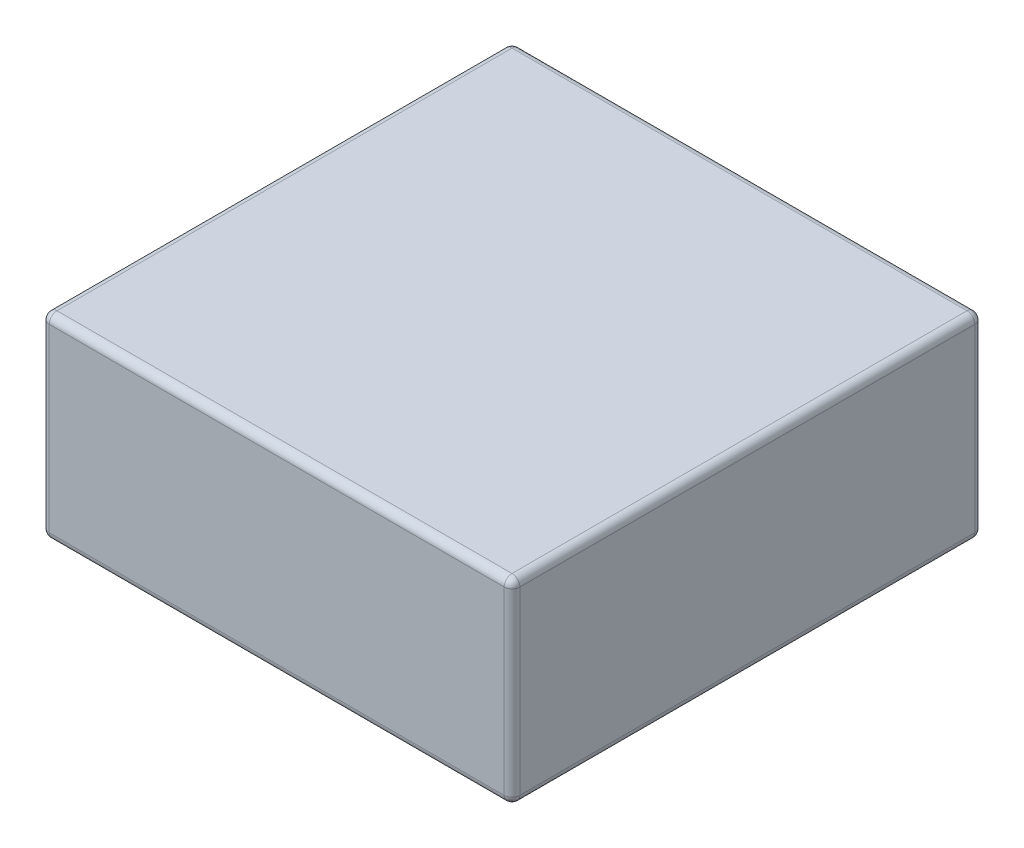
ISO-10303-21;
HEADER;
FILE_DESCRIPTION(('STEP AP214'),'2;1');
FILE_NAME('part.step','',(''),(''),'','','');
FILE_SCHEMA(('AUTOMOTIVE_DESIGN { 1 0 10303 214 1 1 1 1 }'));
ENDSEC;
DATA;
#1=APPLICATION_CONTEXT('core data for automotive mechanical design processes');
#2=APPLICATION_PROTOCOL_DEFINITION('international standard','automotive_design',2000,#1);
#3=PRODUCT_CONTEXT('',#1,'mechanical');
#4=PRODUCT('Part','Part','',(#3));
#5=PRODUCT_RELATED_PRODUCT_CATEGORY('part','',(#4));
#6=PRODUCT_DEFINITION_FORMATION('','',#4);
#7=PRODUCT_DEFINITION_CONTEXT('part definition',#1,'design');
#8=PRODUCT_DEFINITION('design','',#6,#7);
#9=PRODUCT_DEFINITION_SHAPE('','',#8);
#10=(LENGTH_UNIT() NAMED_UNIT(*) SI_UNIT(.MILLI.,.METRE.));
#11=(NAMED_UNIT(*) PLANE_ANGLE_UNIT() SI_UNIT($,.RADIAN.));
#12=(NAMED_UNIT(*) SI_UNIT($,.STERADIAN.) SOLID_ANGLE_UNIT());
#13=UNCERTAINTY_MEASURE_WITH_UNIT(LENGTH_MEASURE(1.E-05),#10,'distance_accuracy_value','');
#14=(GEOMETRIC_REPRESENTATION_CONTEXT(3) GLOBAL_UNCERTAINTY_ASSIGNED_CONTEXT((#13)) GLOBAL_UNIT_ASSIGNED_CONTEXT((#10,
#11,#12)) REPRESENTATION_CONTEXT('',''));
#15=CARTESIAN_POINT('',(0.,0.,0.));
#16=DIRECTION('',(0.,0.,1.));
#17=DIRECTION('',(1.,0.,0.));
#18=AXIS2_PLACEMENT_3D('',#15,#16,#17);
#19=CARTESIAN_POINT('',(-60.,12.5,-30.));
#20=DIRECTION('',(0.,0.,-1.));
#21=DIRECTION('',(-1.,0.,0.));
#22=AXIS2_PLACEMENT_3D('',#19,#20,#21);
#23=PLANE('',#22);
#24=DIRECTION('',(1.,0.,0.));
#25=VECTOR('',#24,1.);
#26=CARTESIAN_POINT('',(-60.,-11.5,-30.));
#27=LINE('',#26,#25);
#28=CARTESIAN_POINT('',(-1.,-11.5,-30.));
#29=VERTEX_POINT('',#28);
#30=CARTESIAN_POINT('',(-59.,-11.5,-30.));
#31=VERTEX_POINT('',#30);
#32=EDGE_CURVE('E240',#29,#31,#27,.F.);
#33=ORIENTED_EDGE('',*,*,#32,.T.);
#34=DIRECTION('',(0.,1.,0.));
#35=VECTOR('',#34,1.);
#36=CARTESIAN_POINT('',(-59.,11.5,-30.));
#37=LINE('',#36,#35);
#38=CARTESIAN_POINT('',(-59.,11.5,-30.));
#39=VERTEX_POINT('',#38);
#40=EDGE_CURVE('E136',#31,#39,#37,.T.);
#41=ORIENTED_EDGE('',*,*,#40,.T.);
#42=DIRECTION('',(1.,0.,0.));
#43=VECTOR('',#42,1.);
#44=CARTESIAN_POINT('',(-60.,11.5,-30.));
#45=LINE('',#44,#43);
#46=CARTESIAN_POINT('',(-1.,11.5,-30.));
#47=VERTEX_POINT('',#46);
#48=EDGE_CURVE('E236',#39,#47,#45,.T.);
#49=ORIENTED_EDGE('',*,*,#48,.T.);
#50=DIRECTION('',(0.,1.,0.));
#51=VECTOR('',#50,1.);
#52=CARTESIAN_POINT('',(-1.,12.5,-30.));
#53=LINE('',#52,#51);
#54=EDGE_CURVE('E238',#47,#29,#53,.F.);
#55=ORIENTED_EDGE('',*,*,#54,.T.);
#56=EDGE_LOOP('',(#33,#41,#49,#55));
#57=FACE_BOUND('',#56,.T.);
#58=ADVANCED_FACE('F35',(#57),#23,.T.);
#59=CARTESIAN_POINT('',(-60.,-12.5,30.));
#60=DIRECTION('',(0.,-1.,0.));
#61=DIRECTION('',(0.,0.,-1.));
#62=AXIS2_PLACEMENT_3D('',#59,#60,#61);
#63=PLANE('',#62);
#64=DIRECTION('',(0.,0.,-1.));
#65=VECTOR('',#64,1.);
#66=CARTESIAN_POINT('',(-59.,-12.5,-30.));
#67=LINE('',#66,#65);
#68=CARTESIAN_POINT('',(-59.,-12.5,29.));
#69=VERTEX_POINT('',#68);
#70=CARTESIAN_POINT('',(-59.,-12.5,-29.));
#71=VERTEX_POINT('',#70);
#72=EDGE_CURVE('E227',#69,#71,#67,.T.);
#73=ORIENTED_EDGE('',*,*,#72,.T.);
#74=DIRECTION('',(1.,0.,0.));
#75=VECTOR('',#74,1.);
#76=CARTESIAN_POINT('',(-60.,-12.5,-29.));
#77=LINE('',#76,#75);
#78=CARTESIAN_POINT('',(-1.,-12.5,-29.));
#79=VERTEX_POINT('',#78);
#80=EDGE_CURVE('E251',#71,#79,#77,.T.);
#81=ORIENTED_EDGE('',*,*,#80,.T.);
#82=DIRECTION('',(0.,0.,-1.));
#83=VECTOR('',#82,1.);
#84=CARTESIAN_POINT('',(-1.,-12.5,30.));
#85=LINE('',#84,#83);
#86=CARTESIAN_POINT('',(-1.,-12.5,29.));
#87=VERTEX_POINT('',#86);
#88=EDGE_CURVE('E148',#79,#87,#85,.F.);
#89=ORIENTED_EDGE('',*,*,#88,.T.);
#90=DIRECTION('',(1.,0.,0.));
#91=VECTOR('',#90,1.);
#92=CARTESIAN_POINT('',(-60.,-12.5,29.));
#93=LINE('',#92,#91);
#94=EDGE_CURVE('E249',#87,#69,#93,.F.);
#95=ORIENTED_EDGE('',*,*,#94,.T.);
#96=EDGE_LOOP('',(#73,#81,#89,#95));
#97=FACE_BOUND('',#96,.T.);
#98=ADVANCED_FACE('F299',(#97),#63,.T.);
#99=CARTESIAN_POINT('',(-60.,12.5,30.));
#100=DIRECTION('',(0.,0.,1.));
#101=DIRECTION('',(0.,-1.,0.));
#102=AXIS2_PLACEMENT_3D('',#99,#100,#101);
#103=PLANE('',#102);
#104=DIRECTION('',(1.,0.,0.));
#105=VECTOR('',#104,1.);
#106=CARTESIAN_POINT('',(-60.,11.5,30.));
#107=LINE('',#106,#105);
#108=CARTESIAN_POINT('',(-1.,11.5,30.));
#109=VERTEX_POINT('',#108);
#110=CARTESIAN_POINT('',(-59.,11.5,30.));
#111=VERTEX_POINT('',#110);
#112=EDGE_CURVE('E265',#109,#111,#107,.F.);
#113=ORIENTED_EDGE('',*,*,#112,.T.);
#114=DIRECTION('',(0.,-1.,0.));
#115=VECTOR('',#114,1.);
#116=CARTESIAN_POINT('',(-59.,-11.5,30.));
#117=LINE('',#116,#115);
#118=CARTESIAN_POINT('',(-59.,-11.5,30.));
#119=VERTEX_POINT('',#118);
#120=EDGE_CURVE('E160',#111,#119,#117,.T.);
#121=ORIENTED_EDGE('',*,*,#120,.T.);
#122=DIRECTION('',(1.,0.,0.));
#123=VECTOR('',#122,1.);
#124=CARTESIAN_POINT('',(-60.,-11.5,30.));
#125=LINE('',#124,#123);
#126=CARTESIAN_POINT('',(-1.,-11.5,30.));
#127=VERTEX_POINT('',#126);
#128=EDGE_CURVE('E60',#119,#127,#125,.T.);
#129=ORIENTED_EDGE('',*,*,#128,.T.);
#130=DIRECTION('',(0.,-1.,0.));
#131=VECTOR('',#130,1.);
#132=CARTESIAN_POINT('',(-1.,12.5,30.));
#133=LINE('',#132,#131);
#134=EDGE_CURVE('E267',#127,#109,#133,.F.);
#135=ORIENTED_EDGE('',*,*,#134,.T.);
#136=EDGE_LOOP('',(#113,#121,#129,#135));
#137=FACE_BOUND('',#136,.T.);
#138=ADVANCED_FACE('F283',(#137),#103,.T.);
#139=CARTESIAN_POINT('',(-60.,12.5,30.));
#140=DIRECTION('',(0.,1.,0.));
#141=DIRECTION('',(0.,0.,1.));
#142=AXIS2_PLACEMENT_3D('',#139,#140,#141);
#143=PLANE('',#142);
#144=DIRECTION('',(0.,0.,1.));
#145=VECTOR('',#144,1.);
#146=CARTESIAN_POINT('',(-1.,12.5,30.));
#147=LINE('',#146,#145);
#148=CARTESIAN_POINT('',(-1.,12.5,29.));
#149=VERTEX_POINT('',#148);
#150=CARTESIAN_POINT('',(-1.,12.5,-29.));
#151=VERTEX_POINT('',#150);
#152=EDGE_CURVE('E212',#149,#151,#147,.F.);
#153=ORIENTED_EDGE('',*,*,#152,.T.);
#154=DIRECTION('',(1.,0.,0.));
#155=VECTOR('',#154,1.);
#156=CARTESIAN_POINT('',(-60.,12.5,-29.));
#157=LINE('',#156,#155);
#158=CARTESIAN_POINT('',(-59.,12.5,-29.));
#159=VERTEX_POINT('',#158);
#160=EDGE_CURVE('E11',#151,#159,#157,.F.);
#161=ORIENTED_EDGE('',*,*,#160,.T.);
#162=DIRECTION('',(0.,0.,1.));
#163=VECTOR('',#162,1.);
#164=CARTESIAN_POINT('',(-59.,12.5,30.));
#165=LINE('',#164,#163);
#166=CARTESIAN_POINT('',(-59.,12.5,29.));
#167=VERTEX_POINT('',#166);
#168=EDGE_CURVE('E217',#159,#167,#165,.T.);
#169=ORIENTED_EDGE('',*,*,#168,.T.);
#170=DIRECTION('',(1.,0.,0.));
#171=VECTOR('',#170,1.);
#172=CARTESIAN_POINT('',(-60.,12.5,29.));
#173=LINE('',#172,#171);
#174=EDGE_CURVE('E44',#167,#149,#173,.T.);
#175=ORIENTED_EDGE('',*,*,#174,.T.);
#176=EDGE_LOOP('',(#153,#161,#169,#175));
#177=FACE_BOUND('',#176,.T.);
#178=ADVANCED_FACE('F270',(#177),#143,.T.);
#179=CARTESIAN_POINT('',(-60.,0.,0.));
#180=DIRECTION('',(1.,0.,0.));
#181=DIRECTION('',(0.,0.,-1.));
#182=AXIS2_PLACEMENT_3D('',#179,#180,#181);
#183=PLANE('',#182);
#184=DIRECTION('',(0.,0.,1.));
#185=VECTOR('',#184,1.);
#186=CARTESIAN_POINT('',(-60.,11.5,-30.));
#187=LINE('',#186,#185);
#188=CARTESIAN_POINT('',(-60.,11.5,29.));
#189=VERTEX_POINT('',#188);
#190=CARTESIAN_POINT('',(-60.,11.5,-29.));
#191=VERTEX_POINT('',#190);
#192=EDGE_CURVE('E131',#189,#191,#187,.F.);
#193=ORIENTED_EDGE('',*,*,#192,.T.);
#194=DIRECTION('',(0.,1.,0.));
#195=VECTOR('',#194,1.);
#196=CARTESIAN_POINT('',(-60.,-11.5,-29.));
#197=LINE('',#196,#195);
#198=CARTESIAN_POINT('',(-60.,-11.5,-29.));
#199=VERTEX_POINT('',#198);
#200=EDGE_CURVE('E135',#191,#199,#197,.F.);
#201=ORIENTED_EDGE('',*,*,#200,.T.);
#202=DIRECTION('',(0.,0.,-1.));
#203=VECTOR('',#202,1.);
#204=CARTESIAN_POINT('',(-60.,-11.5,30.));
#205=LINE('',#204,#203);
#206=CARTESIAN_POINT('',(-60.,-11.5,29.));
#207=VERTEX_POINT('',#206);
#208=EDGE_CURVE('E133',#199,#207,#205,.F.);
#209=ORIENTED_EDGE('',*,*,#208,.T.);
#210=DIRECTION('',(0.,-1.,0.));
#211=VECTOR('',#210,1.);
#212=CARTESIAN_POINT('',(-60.,11.5,29.));
#213=LINE('',#212,#211);
#214=EDGE_CURVE('E128',#207,#189,#213,.F.);
#215=ORIENTED_EDGE('',*,*,#214,.T.);
#216=EDGE_LOOP('',(#193,#201,#209,#215));
#217=FACE_BOUND('',#216,.T.);
#218=ADVANCED_FACE('F130',(#217),#183,.F.);
#219=CARTESIAN_POINT('',(0.,0.,0.));
#220=DIRECTION('',(1.,0.,0.));
#221=DIRECTION('',(0.,0.,-1.));
#222=AXIS2_PLACEMENT_3D('',#219,#220,#221);
#223=PLANE('',#222);
#224=DIRECTION('',(0.,0.,-1.));
#225=VECTOR('',#224,1.);
#226=CARTESIAN_POINT('',(0.,-11.5,0.));
#227=LINE('',#226,#225);
#228=CARTESIAN_POINT('',(0.,-11.5,29.));
#229=VERTEX_POINT('',#228);
#230=CARTESIAN_POINT('',(0.,-11.5,-29.));
#231=VERTEX_POINT('',#230);
#232=EDGE_CURVE('E157',#229,#231,#227,.T.);
#233=ORIENTED_EDGE('',*,*,#232,.T.);
#234=DIRECTION('',(0.,1.,0.));
#235=VECTOR('',#234,1.);
#236=CARTESIAN_POINT('',(0.,0.,-29.));
#237=LINE('',#236,#235);
#238=CARTESIAN_POINT('',(0.,11.5,-29.));
#239=VERTEX_POINT('',#238);
#240=EDGE_CURVE('E259',#231,#239,#237,.T.);
#241=ORIENTED_EDGE('',*,*,#240,.T.);
#242=DIRECTION('',(0.,0.,1.));
#243=VECTOR('',#242,1.);
#244=CARTESIAN_POINT('',(0.,11.5,0.));
#245=LINE('',#244,#243);
#246=CARTESIAN_POINT('',(0.,11.5,29.));
#247=VERTEX_POINT('',#246);
#248=EDGE_CURVE('E230',#239,#247,#245,.T.);
#249=ORIENTED_EDGE('',*,*,#248,.T.);
#250=DIRECTION('',(0.,-1.,0.));
#251=VECTOR('',#250,1.);
#252=CARTESIAN_POINT('',(0.,0.,29.));
#253=LINE('',#252,#251);
#254=EDGE_CURVE('E257',#247,#229,#253,.T.);
#255=ORIENTED_EDGE('',*,*,#254,.T.);
#256=EDGE_LOOP('',(#233,#241,#249,#255));
#257=FACE_BOUND('',#256,.T.);
#258=ADVANCED_FACE('F287',(#257),#223,.T.);
#259=CARTESIAN_POINT('',(-59.,11.5,30.));
#260=DIRECTION('',(0.,0.,-1.));
#261=DIRECTION('',(-1.,0.,0.));
#262=AXIS2_PLACEMENT_3D('',#259,#260,#261);
#263=CYLINDRICAL_SURFACE('',#262,1.);
#264=ORIENTED_EDGE('',*,*,#168,.F.);
#265=CARTESIAN_POINT('',(-59.,11.5,-29.));
#266=DIRECTION('',(0.,0.,-1.));
#267=DIRECTION('',(-1.,0.,0.));
#268=AXIS2_PLACEMENT_3D('',#265,#266,#267);
#269=CIRCLE('',#268,1.);
#270=EDGE_CURVE('E147',#159,#191,#269,.F.);
#271=ORIENTED_EDGE('',*,*,#270,.T.);
#272=ORIENTED_EDGE('',*,*,#192,.F.);
#273=CARTESIAN_POINT('',(-59.,11.5,29.));
#274=DIRECTION('',(0.,0.,-1.));
#275=DIRECTION('',(-1.,0.,0.));
#276=AXIS2_PLACEMENT_3D('',#273,#274,#275);
#277=CIRCLE('',#276,1.);
#278=EDGE_CURVE('E144',#189,#167,#277,.T.);
#279=ORIENTED_EDGE('',*,*,#278,.T.);
#280=EDGE_LOOP('',(#264,#271,#272,#279));
#281=FACE_BOUND('',#280,.T.);
#282=ADVANCED_FACE('F143',(#281),#263,.T.);
#283=CARTESIAN_POINT('',(-59.,-11.5,30.));
#284=DIRECTION('',(0.,0.,1.));
#285=DIRECTION('',(1.,0.,0.));
#286=AXIS2_PLACEMENT_3D('',#283,#284,#285);
#287=CYLINDRICAL_SURFACE('',#286,1.);
#288=ORIENTED_EDGE('',*,*,#208,.F.);
#289=CARTESIAN_POINT('',(-59.,-11.5,-29.));
#290=DIRECTION('',(0.,0.,1.));
#291=DIRECTION('',(1.,0.,0.));
#292=AXIS2_PLACEMENT_3D('',#289,#290,#291);
#293=CIRCLE('',#292,1.);
#294=EDGE_CURVE('E247',#199,#71,#293,.T.);
#295=ORIENTED_EDGE('',*,*,#294,.T.);
#296=ORIENTED_EDGE('',*,*,#72,.F.);
#297=CARTESIAN_POINT('',(-59.,-11.5,29.));
#298=DIRECTION('',(0.,0.,1.));
#299=DIRECTION('',(1.,0.,0.));
#300=AXIS2_PLACEMENT_3D('',#297,#298,#299);
#301=CIRCLE('',#300,1.);
#302=EDGE_CURVE('E245',#69,#207,#301,.F.);
#303=ORIENTED_EDGE('',*,*,#302,.T.);
#304=EDGE_LOOP('',(#288,#295,#296,#303));
#305=FACE_BOUND('',#304,.T.);
#306=ADVANCED_FACE('F301',(#305),#287,.T.);
#307=CARTESIAN_POINT('',(-1.,-11.5,0.));
#308=DIRECTION('',(0.,0.,-1.));
#309=DIRECTION('',(-1.,0.,0.));
#310=AXIS2_PLACEMENT_3D('',#307,#308,#309);
#311=CYLINDRICAL_SURFACE('',#310,1.);
#312=ORIENTED_EDGE('',*,*,#88,.F.);
#313=CARTESIAN_POINT('',(-1.,-11.5,-29.));
#314=DIRECTION('',(0.,0.,-1.));
#315=DIRECTION('',(-1.,0.,0.));
#316=AXIS2_PLACEMENT_3D('',#313,#314,#315);
#317=CIRCLE('',#316,1.);
#318=EDGE_CURVE('E255',#79,#231,#317,.F.);
#319=ORIENTED_EDGE('',*,*,#318,.T.);
#320=ORIENTED_EDGE('',*,*,#232,.F.);
#321=CARTESIAN_POINT('',(-1.,-11.5,29.));
#322=DIRECTION('',(0.,0.,-1.));
#323=DIRECTION('',(-1.,0.,0.));
#324=AXIS2_PLACEMENT_3D('',#321,#322,#323);
#325=CIRCLE('',#324,1.);
#326=EDGE_CURVE('E253',#229,#87,#325,.T.);
#327=ORIENTED_EDGE('',*,*,#326,.T.);
#328=EDGE_LOOP('',(#312,#319,#320,#327));
#329=FACE_BOUND('',#328,.T.);
#330=ADVANCED_FACE('F291',(#329),#311,.T.);
#331=CARTESIAN_POINT('',(-1.,11.5,0.));
#332=DIRECTION('',(0.,0.,1.));
#333=DIRECTION('',(1.,0.,0.));
#334=AXIS2_PLACEMENT_3D('',#331,#332,#333);
#335=CYLINDRICAL_SURFACE('',#334,1.);
#336=ORIENTED_EDGE('',*,*,#248,.F.);
#337=CARTESIAN_POINT('',(-1.,11.5,-29.));
#338=DIRECTION('',(0.,0.,1.));
#339=DIRECTION('',(1.,0.,0.));
#340=AXIS2_PLACEMENT_3D('',#337,#338,#339);
#341=CIRCLE('',#340,1.);
#342=EDGE_CURVE('E263',#239,#151,#341,.T.);
#343=ORIENTED_EDGE('',*,*,#342,.T.);
#344=ORIENTED_EDGE('',*,*,#152,.F.);
#345=CARTESIAN_POINT('',(-1.,11.5,29.));
#346=DIRECTION('',(0.,0.,1.));
#347=DIRECTION('',(1.,0.,0.));
#348=AXIS2_PLACEMENT_3D('',#345,#346,#347);
#349=CIRCLE('',#348,1.);
#350=EDGE_CURVE('E261',#149,#247,#349,.F.);
#351=ORIENTED_EDGE('',*,*,#350,.T.);
#352=EDGE_LOOP('',(#336,#343,#344,#351));
#353=FACE_BOUND('',#352,.T.);
#354=ADVANCED_FACE('F275',(#353),#335,.T.);
#355=CARTESIAN_POINT('',(-1.,-11.5,-29.));
#356=DIRECTION('',(0.,0.,-1.));
#357=DIRECTION('',(-1.,0.,0.));
#358=AXIS2_PLACEMENT_3D('',#355,#356,#357);
#359=SPHERICAL_SURFACE('',#358,1.);
#360=CARTESIAN_POINT('',(-1.,-11.5,-29.));
#361=DIRECTION('',(0.,1.,0.));
#362=DIRECTION('',(0.,0.,1.));
#363=AXIS2_PLACEMENT_3D('',#360,#361,#362);
#364=CIRCLE('',#363,1.);
#365=EDGE_CURVE('E204',#231,#29,#364,.T.);
#366=ORIENTED_EDGE('',*,*,#365,.F.);
#367=ORIENTED_EDGE('',*,*,#318,.F.);
#368=CARTESIAN_POINT('',(-1.,-11.5,-29.));
#369=DIRECTION('',(-1.,0.,0.));
#370=DIRECTION('',(0.,-1.,0.));
#371=AXIS2_PLACEMENT_3D('',#368,#369,#370);
#372=CIRCLE('',#371,1.);
#373=EDGE_CURVE('E164',#29,#79,#372,.T.);
#374=ORIENTED_EDGE('',*,*,#373,.F.);
#375=EDGE_LOOP('',(#366,#367,#374));
#376=FACE_BOUND('',#375,.T.);
#377=ADVANCED_FACE('F315',(#376),#359,.T.);
#378=CARTESIAN_POINT('',(-60.,-11.5,-29.));
#379=DIRECTION('',(1.,0.,0.));
#380=DIRECTION('',(0.,0.,-1.));
#381=AXIS2_PLACEMENT_3D('',#378,#379,#380);
#382=CYLINDRICAL_SURFACE('',#381,1.);
#383=ORIENTED_EDGE('',*,*,#373,.T.);
#384=ORIENTED_EDGE('',*,*,#80,.F.);
#385=CARTESIAN_POINT('',(-59.,-11.5,-29.));
#386=DIRECTION('',(-1.,0.,0.));
#387=DIRECTION('',(0.,0.,1.));
#388=AXIS2_PLACEMENT_3D('',#385,#386,#387);
#389=CIRCLE('',#388,1.);
#390=EDGE_CURVE('E202',#31,#71,#389,.T.);
#391=ORIENTED_EDGE('',*,*,#390,.F.);
#392=ORIENTED_EDGE('',*,*,#32,.F.);
#393=EDGE_LOOP('',(#383,#384,#391,#392));
#394=FACE_BOUND('',#393,.T.);
#395=ADVANCED_FACE('F313',(#394),#382,.T.);
#396=CARTESIAN_POINT('',(-1.,0.,-29.));
#397=DIRECTION('',(0.,1.,0.));
#398=DIRECTION('',(0.,0.,1.));
#399=AXIS2_PLACEMENT_3D('',#396,#397,#398);
#400=CYLINDRICAL_SURFACE('',#399,1.);
#401=ORIENTED_EDGE('',*,*,#365,.T.);
#402=ORIENTED_EDGE('',*,*,#54,.F.);
#403=CARTESIAN_POINT('',(-1.,11.5,-29.));
#404=DIRECTION('',(0.,1.,0.));
#405=DIRECTION('',(0.,0.,1.));
#406=AXIS2_PLACEMENT_3D('',#403,#404,#405);
#407=CIRCLE('',#406,1.);
#408=EDGE_CURVE('E199',#239,#47,#407,.T.);
#409=ORIENTED_EDGE('',*,*,#408,.F.);
#410=ORIENTED_EDGE('',*,*,#240,.F.);
#411=EDGE_LOOP('',(#401,#402,#409,#410));
#412=FACE_BOUND('',#411,.T.);
#413=ADVANCED_FACE('F317',(#412),#400,.T.);
#414=CARTESIAN_POINT('',(-59.,-11.5,-29.));
#415=DIRECTION('',(0.,0.,-1.));
#416=DIRECTION('',(-1.,0.,0.));
#417=AXIS2_PLACEMENT_3D('',#414,#415,#416);
#418=SPHERICAL_SURFACE('',#417,1.);
#419=ORIENTED_EDGE('',*,*,#390,.T.);
#420=ORIENTED_EDGE('',*,*,#294,.F.);
#421=CARTESIAN_POINT('',(-59.,-11.5,-29.));
#422=DIRECTION('',(0.,1.,0.));
#423=DIRECTION('',(0.,0.,1.));
#424=AXIS2_PLACEMENT_3D('',#421,#422,#423);
#425=CIRCLE('',#424,1.);
#426=EDGE_CURVE('E196',#31,#199,#425,.T.);
#427=ORIENTED_EDGE('',*,*,#426,.F.);
#428=EDGE_LOOP('',(#419,#420,#427));
#429=FACE_BOUND('',#428,.T.);
#430=ADVANCED_FACE('F305',(#429),#418,.T.);
#431=CARTESIAN_POINT('',(-1.,11.5,-29.));
#432=DIRECTION('',(0.,0.,-1.));
#433=DIRECTION('',(-1.,0.,0.));
#434=AXIS2_PLACEMENT_3D('',#431,#432,#433);
#435=SPHERICAL_SURFACE('',#434,1.);
#436=ORIENTED_EDGE('',*,*,#342,.F.);
#437=ORIENTED_EDGE('',*,*,#408,.T.);
#438=CARTESIAN_POINT('',(-1.,11.5,-29.));
#439=DIRECTION('',(-1.,0.,0.));
#440=DIRECTION('',(0.,-1.,0.));
#441=AXIS2_PLACEMENT_3D('',#438,#439,#440);
#442=CIRCLE('',#441,1.);
#443=EDGE_CURVE('E190',#151,#47,#442,.T.);
#444=ORIENTED_EDGE('',*,*,#443,.F.);
#445=EDGE_LOOP('',(#436,#437,#444));
#446=FACE_BOUND('',#445,.T.);
#447=ADVANCED_FACE('F319',(#446),#435,.T.);
#448=CARTESIAN_POINT('',(-59.,12.5,-29.));
#449=DIRECTION('',(0.,-1.,0.));
#450=DIRECTION('',(0.,0.,-1.));
#451=AXIS2_PLACEMENT_3D('',#448,#449,#450);
#452=CYLINDRICAL_SURFACE('',#451,1.);
#453=ORIENTED_EDGE('',*,*,#426,.T.);
#454=ORIENTED_EDGE('',*,*,#200,.F.);
#455=CARTESIAN_POINT('',(-59.,11.5,-29.));
#456=DIRECTION('',(0.,1.,0.));
#457=DIRECTION('',(0.,0.,1.));
#458=AXIS2_PLACEMENT_3D('',#455,#456,#457);
#459=CIRCLE('',#458,1.);
#460=EDGE_CURVE('E185',#39,#191,#459,.T.);
#461=ORIENTED_EDGE('',*,*,#460,.F.);
#462=ORIENTED_EDGE('',*,*,#40,.F.);
#463=EDGE_LOOP('',(#453,#454,#461,#462));
#464=FACE_BOUND('',#463,.T.);
#465=ADVANCED_FACE('F310',(#464),#452,.T.);
#466=CARTESIAN_POINT('',(-60.,11.5,-29.));
#467=DIRECTION('',(1.,0.,0.));
#468=DIRECTION('',(0.,0.,-1.));
#469=AXIS2_PLACEMENT_3D('',#466,#467,#468);
#470=CYLINDRICAL_SURFACE('',#469,1.);
#471=ORIENTED_EDGE('',*,*,#443,.T.);
#472=ORIENTED_EDGE('',*,*,#48,.F.);
#473=CARTESIAN_POINT('',(-59.,11.5,-29.));
#474=DIRECTION('',(-1.,0.,0.));
#475=DIRECTION('',(0.,0.,1.));
#476=AXIS2_PLACEMENT_3D('',#473,#474,#475);
#477=CIRCLE('',#476,1.);
#478=EDGE_CURVE('E181',#159,#39,#477,.T.);
#479=ORIENTED_EDGE('',*,*,#478,.F.);
#480=ORIENTED_EDGE('',*,*,#160,.F.);
#481=EDGE_LOOP('',(#471,#472,#479,#480));
#482=FACE_BOUND('',#481,.T.);
#483=ADVANCED_FACE('F322',(#482),#470,.T.);
#484=CARTESIAN_POINT('',(-59.,11.5,-29.));
#485=DIRECTION('',(0.,0.,-1.));
#486=DIRECTION('',(-1.,0.,0.));
#487=AXIS2_PLACEMENT_3D('',#484,#485,#486);
#488=SPHERICAL_SURFACE('',#487,1.);
#489=ORIENTED_EDGE('',*,*,#460,.T.);
#490=ORIENTED_EDGE('',*,*,#270,.F.);
#491=ORIENTED_EDGE('',*,*,#478,.T.);
#492=EDGE_LOOP('',(#489,#490,#491));
#493=FACE_BOUND('',#492,.T.);
#494=ADVANCED_FACE('F323',(#493),#488,.T.);
#495=CARTESIAN_POINT('',(-1.,-11.5,29.));
#496=DIRECTION('',(0.,0.,1.));
#497=DIRECTION('',(0.,-1.,0.));
#498=AXIS2_PLACEMENT_3D('',#495,#496,#497);
#499=SPHERICAL_SURFACE('',#498,1.);
#500=CARTESIAN_POINT('',(-1.,-11.5,29.));
#501=DIRECTION('',(-1.,0.,0.));
#502=DIRECTION('',(0.,-1.,0.));
#503=AXIS2_PLACEMENT_3D('',#500,#501,#502);
#504=CIRCLE('',#503,1.);
#505=EDGE_CURVE('E175',#87,#127,#504,.T.);
#506=ORIENTED_EDGE('',*,*,#505,.F.);
#507=ORIENTED_EDGE('',*,*,#326,.F.);
#508=CARTESIAN_POINT('',(-1.,-11.5,29.));
#509=DIRECTION('',(0.,1.,0.));
#510=DIRECTION('',(0.,0.,1.));
#511=AXIS2_PLACEMENT_3D('',#508,#509,#510);
#512=CIRCLE('',#511,1.);
#513=EDGE_CURVE('E39',#127,#229,#512,.T.);
#514=ORIENTED_EDGE('',*,*,#513,.F.);
#515=EDGE_LOOP('',(#506,#507,#514));
#516=FACE_BOUND('',#515,.T.);
#517=ADVANCED_FACE('F37',(#516),#499,.T.);
#518=CARTESIAN_POINT('',(-1.,0.,29.));
#519=DIRECTION('',(0.,-1.,0.));
#520=DIRECTION('',(0.,0.,-1.));
#521=AXIS2_PLACEMENT_3D('',#518,#519,#520);
#522=CYLINDRICAL_SURFACE('',#521,1.);
#523=ORIENTED_EDGE('',*,*,#513,.T.);
#524=ORIENTED_EDGE('',*,*,#254,.F.);
#525=CARTESIAN_POINT('',(-1.,11.5,29.));
#526=DIRECTION('',(0.,1.,0.));
#527=DIRECTION('',(0.,0.,1.));
#528=AXIS2_PLACEMENT_3D('',#525,#526,#527);
#529=CIRCLE('',#528,1.);
#530=EDGE_CURVE('E173',#109,#247,#529,.T.);
#531=ORIENTED_EDGE('',*,*,#530,.F.);
#532=ORIENTED_EDGE('',*,*,#134,.F.);
#533=EDGE_LOOP('',(#523,#524,#531,#532));
#534=FACE_BOUND('',#533,.T.);
#535=ADVANCED_FACE('F284',(#534),#522,.T.);
#536=CARTESIAN_POINT('',(-60.,-11.5,29.));
#537=DIRECTION('',(1.,0.,0.));
#538=DIRECTION('',(0.,0.,-1.));
#539=AXIS2_PLACEMENT_3D('',#536,#537,#538);
#540=CYLINDRICAL_SURFACE('',#539,1.);
#541=ORIENTED_EDGE('',*,*,#505,.T.);
#542=ORIENTED_EDGE('',*,*,#128,.F.);
#543=CARTESIAN_POINT('',(-59.,-11.5,29.));
#544=DIRECTION('',(-1.,0.,0.));
#545=DIRECTION('',(0.,0.,1.));
#546=AXIS2_PLACEMENT_3D('',#543,#544,#545);
#547=CIRCLE('',#546,1.);
#548=EDGE_CURVE('E171',#69,#119,#547,.T.);
#549=ORIENTED_EDGE('',*,*,#548,.F.);
#550=ORIENTED_EDGE('',*,*,#94,.F.);
#551=EDGE_LOOP('',(#541,#542,#549,#550));
#552=FACE_BOUND('',#551,.T.);
#553=ADVANCED_FACE('F295',(#552),#540,.T.);
#554=CARTESIAN_POINT('',(-1.,11.5,29.));
#555=DIRECTION('',(0.,0.,1.));
#556=DIRECTION('',(0.,-1.,0.));
#557=AXIS2_PLACEMENT_3D('',#554,#555,#556);
#558=SPHERICAL_SURFACE('',#557,1.);
#559=ORIENTED_EDGE('',*,*,#530,.T.);
#560=ORIENTED_EDGE('',*,*,#350,.F.);
#561=CARTESIAN_POINT('',(-1.,11.5,29.));
#562=DIRECTION('',(-1.,0.,0.));
#563=DIRECTION('',(0.,-1.,0.));
#564=AXIS2_PLACEMENT_3D('',#561,#562,#563);
#565=CIRCLE('',#564,1.);
#566=EDGE_CURVE('E168',#109,#149,#565,.T.);
#567=ORIENTED_EDGE('',*,*,#566,.F.);
#568=EDGE_LOOP('',(#559,#560,#567));
#569=FACE_BOUND('',#568,.T.);
#570=ADVANCED_FACE('F279',(#569),#558,.T.);
#571=CARTESIAN_POINT('',(-59.,-11.5,29.));
#572=DIRECTION('',(0.,0.,1.));
#573=DIRECTION('',(0.,-1.,0.));
#574=AXIS2_PLACEMENT_3D('',#571,#572,#573);
#575=SPHERICAL_SURFACE('',#574,1.);
#576=ORIENTED_EDGE('',*,*,#302,.F.);
#577=ORIENTED_EDGE('',*,*,#548,.T.);
#578=CARTESIAN_POINT('',(-59.,-11.5,29.));
#579=DIRECTION('',(0.,1.,0.));
#580=DIRECTION('',(0.,0.,1.));
#581=AXIS2_PLACEMENT_3D('',#578,#579,#580);
#582=CIRCLE('',#581,1.);
#583=EDGE_CURVE('E52',#207,#119,#582,.T.);
#584=ORIENTED_EDGE('',*,*,#583,.F.);
#585=EDGE_LOOP('',(#576,#577,#584));
#586=FACE_BOUND('',#585,.T.);
#587=ADVANCED_FACE('F363',(#586),#575,.T.);
#588=CARTESIAN_POINT('',(-60.,11.5,29.));
#589=DIRECTION('',(1.,0.,0.));
#590=DIRECTION('',(0.,0.,-1.));
#591=AXIS2_PLACEMENT_3D('',#588,#589,#590);
#592=CYLINDRICAL_SURFACE('',#591,1.);
#593=ORIENTED_EDGE('',*,*,#566,.T.);
#594=ORIENTED_EDGE('',*,*,#174,.F.);
#595=CARTESIAN_POINT('',(-59.,11.5,29.));
#596=DIRECTION('',(-1.,0.,0.));
#597=DIRECTION('',(0.,0.,1.));
#598=AXIS2_PLACEMENT_3D('',#595,#596,#597);
#599=CIRCLE('',#598,1.);
#600=EDGE_CURVE('E155',#111,#167,#599,.T.);
#601=ORIENTED_EDGE('',*,*,#600,.F.);
#602=ORIENTED_EDGE('',*,*,#112,.F.);
#603=EDGE_LOOP('',(#593,#594,#601,#602));
#604=FACE_BOUND('',#603,.T.);
#605=ADVANCED_FACE('F282',(#604),#592,.T.);
#606=CARTESIAN_POINT('',(-59.,12.5,29.));
#607=DIRECTION('',(0.,1.,0.));
#608=DIRECTION('',(0.,0.,1.));
#609=AXIS2_PLACEMENT_3D('',#606,#607,#608);
#610=CYLINDRICAL_SURFACE('',#609,1.);
#611=ORIENTED_EDGE('',*,*,#583,.T.);
#612=ORIENTED_EDGE('',*,*,#120,.F.);
#613=CARTESIAN_POINT('',(-59.,11.5,29.));
#614=DIRECTION('',(0.,1.,0.));
#615=DIRECTION('',(0.,0.,1.));
#616=AXIS2_PLACEMENT_3D('',#613,#614,#615);
#617=CIRCLE('',#616,1.);
#618=EDGE_CURVE('E153',#189,#111,#617,.T.);
#619=ORIENTED_EDGE('',*,*,#618,.F.);
#620=ORIENTED_EDGE('',*,*,#214,.F.);
#621=EDGE_LOOP('',(#611,#612,#619,#620));
#622=FACE_BOUND('',#621,.T.);
#623=ADVANCED_FACE('F159',(#622),#610,.T.);
#624=CARTESIAN_POINT('',(-59.,11.5,29.));
#625=DIRECTION('',(0.,0.,1.));
#626=DIRECTION('',(0.,-1.,0.));
#627=AXIS2_PLACEMENT_3D('',#624,#625,#626);
#628=SPHERICAL_SURFACE('',#627,1.);
#629=ORIENTED_EDGE('',*,*,#600,.T.);
#630=ORIENTED_EDGE('',*,*,#278,.F.);
#631=ORIENTED_EDGE('',*,*,#618,.T.);
#632=EDGE_LOOP('',(#629,#630,#631));
#633=FACE_BOUND('',#632,.T.);
#634=ADVANCED_FACE('F152',(#633),#628,.T.);
#635=CLOSED_SHELL('',(#58,#98,#138,#178,#218,#258,#282,#306,#330,#354,#377,#395,#413,#430,#447,
#465,#483,#494,#517,#535,#553,#570,#587,#605,#623,#634));
#636=MANIFOLD_SOLID_BREP('B2',#635);
#637=ADVANCED_BREP_SHAPE_REPRESENTATION('',(#18,#636),#14);
#638=SHAPE_DEFINITION_REPRESENTATION(#9,#637);
ENDSEC;
END-ISO-10303-21;
